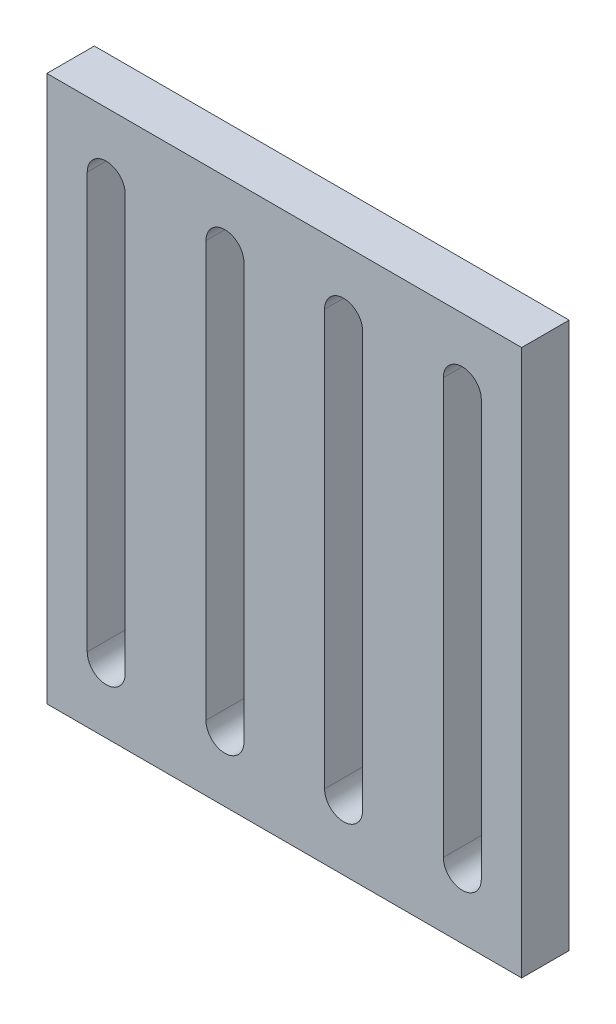
ISO-10303-21;
HEADER;
FILE_DESCRIPTION(('STEP AP214'),'2;1');
FILE_NAME('part.step','',(''),(''),'','','');
FILE_SCHEMA(('AUTOMOTIVE_DESIGN { 1 0 10303 214 1 1 1 1 }'));
ENDSEC;
DATA;
#1=APPLICATION_CONTEXT('core data for automotive mechanical design processes');
#2=APPLICATION_PROTOCOL_DEFINITION('international standard','automotive_design',2000,#1);
#3=PRODUCT_CONTEXT('',#1,'mechanical');
#4=PRODUCT('Part','Part','',(#3));
#5=PRODUCT_RELATED_PRODUCT_CATEGORY('part','',(#4));
#6=PRODUCT_DEFINITION_FORMATION('','',#4);
#7=PRODUCT_DEFINITION_CONTEXT('part definition',#1,'design');
#8=PRODUCT_DEFINITION('design','',#6,#7);
#9=PRODUCT_DEFINITION_SHAPE('','',#8);
#10=(LENGTH_UNIT() NAMED_UNIT(*) SI_UNIT(.MILLI.,.METRE.));
#11=(NAMED_UNIT(*) PLANE_ANGLE_UNIT() SI_UNIT($,.RADIAN.));
#12=(NAMED_UNIT(*) SI_UNIT($,.STERADIAN.) SOLID_ANGLE_UNIT());
#13=UNCERTAINTY_MEASURE_WITH_UNIT(LENGTH_MEASURE(1.E-05),#10,'distance_accuracy_value','');
#14=(GEOMETRIC_REPRESENTATION_CONTEXT(3) GLOBAL_UNCERTAINTY_ASSIGNED_CONTEXT((#13)) GLOBAL_UNIT_ASSIGNED_CONTEXT((#10,
#11,#12)) REPRESENTATION_CONTEXT('',''));
#15=CARTESIAN_POINT('',(0.,0.,0.));
#16=DIRECTION('',(0.,0.,1.));
#17=DIRECTION('',(1.,0.,0.));
#18=AXIS2_PLACEMENT_3D('',#15,#16,#17);
#19=CARTESIAN_POINT('',(0.,0.,4.));
#20=DIRECTION('',(0.,0.,-1.));
#21=DIRECTION('',(-1.,0.,0.));
#22=AXIS2_PLACEMENT_3D('',#19,#20,#21);
#23=PLANE('',#22);
#24=DIRECTION('',(0.,1.,0.));
#25=VECTOR('',#24,1.);
#26=CARTESIAN_POINT('',(5.,-23.,4.));
#27=LINE('',#26,#25);
#28=CARTESIAN_POINT('',(5.,-23.,4.));
#29=VERTEX_POINT('',#28);
#30=CARTESIAN_POINT('',(5.,23.,4.));
#31=VERTEX_POINT('',#30);
#32=EDGE_CURVE('E313',#29,#31,#27,.T.);
#33=ORIENTED_EDGE('',*,*,#32,.T.);
#34=DIRECTION('',(-1.,0.,0.));
#35=VECTOR('',#34,1.);
#36=CARTESIAN_POINT('',(-5.,23.,4.));
#37=LINE('',#36,#35);
#38=CARTESIAN_POINT('',(-35.,23.,4.));
#39=VERTEX_POINT('',#38);
#40=EDGE_CURVE('E316',#31,#39,#37,.T.);
#41=ORIENTED_EDGE('',*,*,#40,.T.);
#42=DIRECTION('',(0.,-1.,0.));
#43=VECTOR('',#42,1.);
#44=CARTESIAN_POINT('',(-35.,-23.,4.));
#45=LINE('',#44,#43);
#46=CARTESIAN_POINT('',(-35.,-23.,4.));
#47=VERTEX_POINT('',#46);
#48=EDGE_CURVE('E214',#39,#47,#45,.T.);
#49=ORIENTED_EDGE('',*,*,#48,.T.);
#50=DIRECTION('',(1.,0.,0.));
#51=VECTOR('',#50,1.);
#52=CARTESIAN_POINT('',(-5.,-23.,4.));
#53=LINE('',#52,#51);
#54=EDGE_CURVE('E319',#47,#29,#53,.T.);
#55=ORIENTED_EDGE('',*,*,#54,.T.);
#56=EDGE_LOOP('',(#33,#41,#49,#55));
#57=FACE_BOUND('',#56,.T.);
#58=CARTESIAN_POINT('',(0.,17.5,4.));
#59=DIRECTION('',(0.,0.,1.));
#60=DIRECTION('',(1.,0.,0.));
#61=AXIS2_PLACEMENT_3D('',#58,#59,#60);
#62=CIRCLE('',#61,1.6);
#63=CARTESIAN_POINT('',(1.59999999999999,17.5,4.));
#64=VERTEX_POINT('',#63);
#65=CARTESIAN_POINT('',(-1.60000000000001,17.5,4.));
#66=VERTEX_POINT('',#65);
#67=EDGE_CURVE('E287',#64,#66,#62,.T.);
#68=ORIENTED_EDGE('',*,*,#67,.F.);
#69=DIRECTION('',(0.,1.,0.));
#70=VECTOR('',#69,1.);
#71=CARTESIAN_POINT('',(1.59999999999999,17.5,4.));
#72=LINE('',#71,#70);
#73=CARTESIAN_POINT('',(1.6,-17.5,4.));
#74=VERTEX_POINT('',#73);
#75=EDGE_CURVE('E294',#74,#64,#72,.T.);
#76=ORIENTED_EDGE('',*,*,#75,.F.);
#77=CARTESIAN_POINT('',(0.,-17.5,4.));
#78=DIRECTION('',(0.,0.,1.));
#79=DIRECTION('',(1.,0.,0.));
#80=AXIS2_PLACEMENT_3D('',#77,#78,#79);
#81=CIRCLE('',#80,1.6);
#82=CARTESIAN_POINT('',(-1.6,-17.5,4.));
#83=VERTEX_POINT('',#82);
#84=EDGE_CURVE('E292',#83,#74,#81,.T.);
#85=ORIENTED_EDGE('',*,*,#84,.F.);
#86=DIRECTION('',(0.,-1.,0.));
#87=VECTOR('',#86,1.);
#88=CARTESIAN_POINT('',(-1.60000000000001,17.5,4.));
#89=LINE('',#88,#87);
#90=EDGE_CURVE('E289',#66,#83,#89,.T.);
#91=ORIENTED_EDGE('',*,*,#90,.F.);
#92=EDGE_LOOP('',(#68,#76,#85,#91));
#93=FACE_BOUND('',#92,.T.);
#94=CARTESIAN_POINT('',(-10.,17.5,4.));
#95=DIRECTION('',(0.,0.,1.));
#96=DIRECTION('',(1.,0.,0.));
#97=AXIS2_PLACEMENT_3D('',#94,#95,#96);
#98=CIRCLE('',#97,1.6);
#99=CARTESIAN_POINT('',(-8.40000000000001,17.5,4.));
#100=VERTEX_POINT('',#99);
#101=CARTESIAN_POINT('',(-11.6,17.5,4.));
#102=VERTEX_POINT('',#101);
#103=EDGE_CURVE('E257',#100,#102,#98,.T.);
#104=ORIENTED_EDGE('',*,*,#103,.F.);
#105=DIRECTION('',(0.,1.,0.));
#106=VECTOR('',#105,1.);
#107=CARTESIAN_POINT('',(-8.40000000000001,17.5,4.));
#108=LINE('',#107,#106);
#109=CARTESIAN_POINT('',(-8.4,-17.5,4.));
#110=VERTEX_POINT('',#109);
#111=EDGE_CURVE('E265',#110,#100,#108,.T.);
#112=ORIENTED_EDGE('',*,*,#111,.F.);
#113=CARTESIAN_POINT('',(-10.,-17.5,4.));
#114=DIRECTION('',(0.,0.,1.));
#115=DIRECTION('',(1.,0.,0.));
#116=AXIS2_PLACEMENT_3D('',#113,#114,#115);
#117=CIRCLE('',#116,1.6);
#118=CARTESIAN_POINT('',(-11.6,-17.5,4.));
#119=VERTEX_POINT('',#118);
#120=EDGE_CURVE('E262',#119,#110,#117,.T.);
#121=ORIENTED_EDGE('',*,*,#120,.F.);
#122=DIRECTION('',(0.,-1.,0.));
#123=VECTOR('',#122,1.);
#124=CARTESIAN_POINT('',(-11.6,17.5,4.));
#125=LINE('',#124,#123);
#126=EDGE_CURVE('E259',#102,#119,#125,.T.);
#127=ORIENTED_EDGE('',*,*,#126,.F.);
#128=EDGE_LOOP('',(#104,#112,#121,#127));
#129=FACE_BOUND('',#128,.T.);
#130=CARTESIAN_POINT('',(-20.,17.5,4.));
#131=DIRECTION('',(0.,0.,1.));
#132=DIRECTION('',(1.,0.,0.));
#133=AXIS2_PLACEMENT_3D('',#130,#131,#132);
#134=CIRCLE('',#133,1.6);
#135=CARTESIAN_POINT('',(-18.4,17.5,4.));
#136=VERTEX_POINT('',#135);
#137=CARTESIAN_POINT('',(-21.6,17.5,4.));
#138=VERTEX_POINT('',#137);
#139=EDGE_CURVE('E226',#136,#138,#134,.T.);
#140=ORIENTED_EDGE('',*,*,#139,.F.);
#141=DIRECTION('',(0.,1.,0.));
#142=VECTOR('',#141,1.);
#143=CARTESIAN_POINT('',(-18.4,17.5,4.));
#144=LINE('',#143,#142);
#145=CARTESIAN_POINT('',(-18.4,-17.5,4.));
#146=VERTEX_POINT('',#145);
#147=EDGE_CURVE('E234',#146,#136,#144,.T.);
#148=ORIENTED_EDGE('',*,*,#147,.F.);
#149=CARTESIAN_POINT('',(-20.,-17.5,4.));
#150=DIRECTION('',(0.,0.,1.));
#151=DIRECTION('',(1.,0.,0.));
#152=AXIS2_PLACEMENT_3D('',#149,#150,#151);
#153=CIRCLE('',#152,1.6);
#154=CARTESIAN_POINT('',(-21.6,-17.5,4.));
#155=VERTEX_POINT('',#154);
#156=EDGE_CURVE('E231',#155,#146,#153,.T.);
#157=ORIENTED_EDGE('',*,*,#156,.F.);
#158=DIRECTION('',(0.,-1.,0.));
#159=VECTOR('',#158,1.);
#160=CARTESIAN_POINT('',(-21.6,17.5,4.));
#161=LINE('',#160,#159);
#162=EDGE_CURVE('E228',#138,#155,#161,.T.);
#163=ORIENTED_EDGE('',*,*,#162,.F.);
#164=EDGE_LOOP('',(#140,#148,#157,#163));
#165=FACE_BOUND('',#164,.T.);
#166=CARTESIAN_POINT('',(-30.,17.5,4.));
#167=DIRECTION('',(0.,0.,1.));
#168=DIRECTION('',(1.,0.,0.));
#169=AXIS2_PLACEMENT_3D('',#166,#167,#168);
#170=CIRCLE('',#169,1.6);
#171=CARTESIAN_POINT('',(-28.4,17.5,4.));
#172=VERTEX_POINT('',#171);
#173=CARTESIAN_POINT('',(-31.6,17.5,4.));
#174=VERTEX_POINT('',#173);
#175=EDGE_CURVE('E173',#172,#174,#170,.T.);
#176=ORIENTED_EDGE('',*,*,#175,.F.);
#177=DIRECTION('',(0.,1.,0.));
#178=VECTOR('',#177,1.);
#179=CARTESIAN_POINT('',(-28.4,17.5,4.));
#180=LINE('',#179,#178);
#181=CARTESIAN_POINT('',(-28.4,-17.5,4.));
#182=VERTEX_POINT('',#181);
#183=EDGE_CURVE('E198',#182,#172,#180,.T.);
#184=ORIENTED_EDGE('',*,*,#183,.F.);
#185=CARTESIAN_POINT('',(-30.,-17.5,4.));
#186=DIRECTION('',(0.,0.,1.));
#187=DIRECTION('',(1.,0.,0.));
#188=AXIS2_PLACEMENT_3D('',#185,#186,#187);
#189=CIRCLE('',#188,1.6);
#190=CARTESIAN_POINT('',(-31.6,-17.5,4.));
#191=VERTEX_POINT('',#190);
#192=EDGE_CURVE('E196',#191,#182,#189,.T.);
#193=ORIENTED_EDGE('',*,*,#192,.F.);
#194=DIRECTION('',(0.,-1.,0.));
#195=VECTOR('',#194,1.);
#196=CARTESIAN_POINT('',(-31.6,17.5,4.));
#197=LINE('',#196,#195);
#198=EDGE_CURVE('E183',#174,#191,#197,.T.);
#199=ORIENTED_EDGE('',*,*,#198,.F.);
#200=EDGE_LOOP('',(#176,#184,#193,#199));
#201=FACE_BOUND('',#200,.T.);
#202=ADVANCED_FACE('F33',(#57,#93,#129,#165,#201),#23,.F.);
#203=CARTESIAN_POINT('',(0.,0.,0.));
#204=DIRECTION('',(0.,0.,-1.));
#205=DIRECTION('',(-1.,0.,0.));
#206=AXIS2_PLACEMENT_3D('',#203,#204,#205);
#207=PLANE('',#206);
#208=DIRECTION('',(0.,1.,0.));
#209=VECTOR('',#208,1.);
#210=CARTESIAN_POINT('',(5.,-23.,0.));
#211=LINE('',#210,#209);
#212=CARTESIAN_POINT('',(5.,-23.,0.));
#213=VERTEX_POINT('',#212);
#214=CARTESIAN_POINT('',(5.,23.,0.));
#215=VERTEX_POINT('',#214);
#216=EDGE_CURVE('E312',#213,#215,#211,.T.);
#217=ORIENTED_EDGE('',*,*,#216,.F.);
#218=DIRECTION('',(1.,0.,0.));
#219=VECTOR('',#218,1.);
#220=CARTESIAN_POINT('',(-5.,-23.,0.));
#221=LINE('',#220,#219);
#222=CARTESIAN_POINT('',(-35.,-23.,0.));
#223=VERTEX_POINT('',#222);
#224=EDGE_CURVE('E317',#223,#213,#221,.T.);
#225=ORIENTED_EDGE('',*,*,#224,.F.);
#226=DIRECTION('',(0.,-1.,0.));
#227=VECTOR('',#226,1.);
#228=CARTESIAN_POINT('',(-35.,-23.,0.));
#229=LINE('',#228,#227);
#230=CARTESIAN_POINT('',(-35.,23.,0.));
#231=VERTEX_POINT('',#230);
#232=EDGE_CURVE('E191',#231,#223,#229,.T.);
#233=ORIENTED_EDGE('',*,*,#232,.F.);
#234=DIRECTION('',(-1.,0.,0.));
#235=VECTOR('',#234,1.);
#236=CARTESIAN_POINT('',(-5.,23.,0.));
#237=LINE('',#236,#235);
#238=EDGE_CURVE('E323',#215,#231,#237,.T.);
#239=ORIENTED_EDGE('',*,*,#238,.F.);
#240=EDGE_LOOP('',(#217,#225,#233,#239));
#241=FACE_BOUND('',#240,.T.);
#242=DIRECTION('',(0.,1.,0.));
#243=VECTOR('',#242,1.);
#244=CARTESIAN_POINT('',(1.59999999999999,17.5,0.));
#245=LINE('',#244,#243);
#246=CARTESIAN_POINT('',(1.6,-17.5,0.));
#247=VERTEX_POINT('',#246);
#248=CARTESIAN_POINT('',(1.59999999999999,17.5,0.));
#249=VERTEX_POINT('',#248);
#250=EDGE_CURVE('E290',#247,#249,#245,.T.);
#251=ORIENTED_EDGE('',*,*,#250,.T.);
#252=CARTESIAN_POINT('',(0.,17.5,0.));
#253=DIRECTION('',(0.,0.,1.));
#254=DIRECTION('',(1.,0.,0.));
#255=AXIS2_PLACEMENT_3D('',#252,#253,#254);
#256=CIRCLE('',#255,1.6);
#257=CARTESIAN_POINT('',(-1.60000000000001,17.5,0.));
#258=VERTEX_POINT('',#257);
#259=EDGE_CURVE('E56',#249,#258,#256,.T.);
#260=ORIENTED_EDGE('',*,*,#259,.T.);
#261=DIRECTION('',(0.,-1.,0.));
#262=VECTOR('',#261,1.);
#263=CARTESIAN_POINT('',(-1.60000000000001,17.5,0.));
#264=LINE('',#263,#262);
#265=CARTESIAN_POINT('',(-1.6,-17.5,0.));
#266=VERTEX_POINT('',#265);
#267=EDGE_CURVE('E298',#258,#266,#264,.T.);
#268=ORIENTED_EDGE('',*,*,#267,.T.);
#269=CARTESIAN_POINT('',(0.,-17.5,0.));
#270=DIRECTION('',(0.,0.,1.));
#271=DIRECTION('',(1.,0.,0.));
#272=AXIS2_PLACEMENT_3D('',#269,#270,#271);
#273=CIRCLE('',#272,1.6);
#274=EDGE_CURVE('E301',#266,#247,#273,.T.);
#275=ORIENTED_EDGE('',*,*,#274,.T.);
#276=EDGE_LOOP('',(#251,#260,#268,#275));
#277=FACE_BOUND('',#276,.T.);
#278=DIRECTION('',(0.,1.,0.));
#279=VECTOR('',#278,1.);
#280=CARTESIAN_POINT('',(-8.40000000000001,17.5,0.));
#281=LINE('',#280,#279);
#282=CARTESIAN_POINT('',(-8.4,-17.5,0.));
#283=VERTEX_POINT('',#282);
#284=CARTESIAN_POINT('',(-8.40000000000001,17.5,0.));
#285=VERTEX_POINT('',#284);
#286=EDGE_CURVE('E260',#283,#285,#281,.T.);
#287=ORIENTED_EDGE('',*,*,#286,.T.);
#288=CARTESIAN_POINT('',(-10.,17.5,0.));
#289=DIRECTION('',(0.,0.,1.));
#290=DIRECTION('',(1.,0.,0.));
#291=AXIS2_PLACEMENT_3D('',#288,#289,#290);
#292=CIRCLE('',#291,1.6);
#293=CARTESIAN_POINT('',(-11.6,17.5,0.));
#294=VERTEX_POINT('',#293);
#295=EDGE_CURVE('E256',#285,#294,#292,.T.);
#296=ORIENTED_EDGE('',*,*,#295,.T.);
#297=DIRECTION('',(0.,-1.,0.));
#298=VECTOR('',#297,1.);
#299=CARTESIAN_POINT('',(-11.6,17.5,0.));
#300=LINE('',#299,#298);
#301=CARTESIAN_POINT('',(-11.6,-17.5,0.));
#302=VERTEX_POINT('',#301);
#303=EDGE_CURVE('E270',#294,#302,#300,.T.);
#304=ORIENTED_EDGE('',*,*,#303,.T.);
#305=CARTESIAN_POINT('',(-10.,-17.5,0.));
#306=DIRECTION('',(0.,0.,1.));
#307=DIRECTION('',(1.,0.,0.));
#308=AXIS2_PLACEMENT_3D('',#305,#306,#307);
#309=CIRCLE('',#308,1.6);
#310=EDGE_CURVE('E273',#302,#283,#309,.T.);
#311=ORIENTED_EDGE('',*,*,#310,.T.);
#312=EDGE_LOOP('',(#287,#296,#304,#311));
#313=FACE_BOUND('',#312,.T.);
#314=DIRECTION('',(0.,1.,0.));
#315=VECTOR('',#314,1.);
#316=CARTESIAN_POINT('',(-18.4,17.5,0.));
#317=LINE('',#316,#315);
#318=CARTESIAN_POINT('',(-18.4,-17.5,0.));
#319=VERTEX_POINT('',#318);
#320=CARTESIAN_POINT('',(-18.4,17.5,0.));
#321=VERTEX_POINT('',#320);
#322=EDGE_CURVE('E229',#319,#321,#317,.T.);
#323=ORIENTED_EDGE('',*,*,#322,.T.);
#324=CARTESIAN_POINT('',(-20.,17.5,0.));
#325=DIRECTION('',(0.,0.,1.));
#326=DIRECTION('',(1.,0.,0.));
#327=AXIS2_PLACEMENT_3D('',#324,#325,#326);
#328=CIRCLE('',#327,1.6);
#329=CARTESIAN_POINT('',(-21.6,17.5,0.));
#330=VERTEX_POINT('',#329);
#331=EDGE_CURVE('E225',#321,#330,#328,.T.);
#332=ORIENTED_EDGE('',*,*,#331,.T.);
#333=DIRECTION('',(0.,-1.,0.));
#334=VECTOR('',#333,1.);
#335=CARTESIAN_POINT('',(-21.6,17.5,0.));
#336=LINE('',#335,#334);
#337=CARTESIAN_POINT('',(-21.6,-17.5,0.));
#338=VERTEX_POINT('',#337);
#339=EDGE_CURVE('E239',#330,#338,#336,.T.);
#340=ORIENTED_EDGE('',*,*,#339,.T.);
#341=CARTESIAN_POINT('',(-20.,-17.5,0.));
#342=DIRECTION('',(0.,0.,1.));
#343=DIRECTION('',(1.,0.,0.));
#344=AXIS2_PLACEMENT_3D('',#341,#342,#343);
#345=CIRCLE('',#344,1.6);
#346=EDGE_CURVE('E242',#338,#319,#345,.T.);
#347=ORIENTED_EDGE('',*,*,#346,.T.);
#348=EDGE_LOOP('',(#323,#332,#340,#347));
#349=FACE_BOUND('',#348,.T.);
#350=DIRECTION('',(0.,1.,0.));
#351=VECTOR('',#350,1.);
#352=CARTESIAN_POINT('',(-28.4,17.5,0.));
#353=LINE('',#352,#351);
#354=CARTESIAN_POINT('',(-28.4,-17.5,0.));
#355=VERTEX_POINT('',#354);
#356=CARTESIAN_POINT('',(-28.4,17.5,0.));
#357=VERTEX_POINT('',#356);
#358=EDGE_CURVE('E184',#355,#357,#353,.T.);
#359=ORIENTED_EDGE('',*,*,#358,.T.);
#360=CARTESIAN_POINT('',(-30.,17.5,0.));
#361=DIRECTION('',(0.,0.,1.));
#362=DIRECTION('',(1.,0.,0.));
#363=AXIS2_PLACEMENT_3D('',#360,#361,#362);
#364=CIRCLE('',#363,1.6);
#365=CARTESIAN_POINT('',(-31.6,17.5,0.));
#366=VERTEX_POINT('',#365);
#367=EDGE_CURVE('E202',#357,#366,#364,.T.);
#368=ORIENTED_EDGE('',*,*,#367,.T.);
#369=DIRECTION('',(0.,-1.,0.));
#370=VECTOR('',#369,1.);
#371=CARTESIAN_POINT('',(-31.6,17.5,0.));
#372=LINE('',#371,#370);
#373=CARTESIAN_POINT('',(-31.6,-17.5,0.));
#374=VERTEX_POINT('',#373);
#375=EDGE_CURVE('E190',#366,#374,#372,.T.);
#376=ORIENTED_EDGE('',*,*,#375,.T.);
#377=CARTESIAN_POINT('',(-30.,-17.5,0.));
#378=DIRECTION('',(0.,0.,1.));
#379=DIRECTION('',(1.,0.,0.));
#380=AXIS2_PLACEMENT_3D('',#377,#378,#379);
#381=CIRCLE('',#380,1.6);
#382=EDGE_CURVE('E205',#374,#355,#381,.T.);
#383=ORIENTED_EDGE('',*,*,#382,.T.);
#384=EDGE_LOOP('',(#359,#368,#376,#383));
#385=FACE_BOUND('',#384,.T.);
#386=ADVANCED_FACE('F333',(#241,#277,#313,#349,#385),#207,.T.);
#387=CARTESIAN_POINT('',(5.,-23.,4.));
#388=DIRECTION('',(-1.,0.,0.));
#389=DIRECTION('',(0.,0.,1.));
#390=AXIS2_PLACEMENT_3D('',#387,#388,#389);
#391=PLANE('',#390);
#392=ORIENTED_EDGE('',*,*,#216,.T.);
#393=DIRECTION('',(0.,0.,-1.));
#394=VECTOR('',#393,1.);
#395=CARTESIAN_POINT('',(5.,23.,4.));
#396=LINE('',#395,#394);
#397=EDGE_CURVE('E11',#31,#215,#396,.T.);
#398=ORIENTED_EDGE('',*,*,#397,.F.);
#399=ORIENTED_EDGE('',*,*,#32,.F.);
#400=DIRECTION('',(0.,0.,-1.));
#401=VECTOR('',#400,1.);
#402=CARTESIAN_POINT('',(5.,-23.,4.));
#403=LINE('',#402,#401);
#404=EDGE_CURVE('E41',#29,#213,#403,.T.);
#405=ORIENTED_EDGE('',*,*,#404,.T.);
#406=EDGE_LOOP('',(#392,#398,#399,#405));
#407=FACE_BOUND('',#406,.T.);
#408=ADVANCED_FACE('F35',(#407),#391,.F.);
#409=CARTESIAN_POINT('',(-5.,23.,4.));
#410=DIRECTION('',(0.,-1.,0.));
#411=DIRECTION('',(0.,0.,-1.));
#412=AXIS2_PLACEMENT_3D('',#409,#410,#411);
#413=PLANE('',#412);
#414=ORIENTED_EDGE('',*,*,#238,.T.);
#415=DIRECTION('',(0.,0.,-1.));
#416=VECTOR('',#415,1.);
#417=CARTESIAN_POINT('',(-35.,23.,4.));
#418=LINE('',#417,#416);
#419=EDGE_CURVE('E222',#39,#231,#418,.T.);
#420=ORIENTED_EDGE('',*,*,#419,.F.);
#421=ORIENTED_EDGE('',*,*,#40,.F.);
#422=ORIENTED_EDGE('',*,*,#397,.T.);
#423=EDGE_LOOP('',(#414,#420,#421,#422));
#424=FACE_BOUND('',#423,.T.);
#425=ADVANCED_FACE('F338',(#424),#413,.F.);
#426=CARTESIAN_POINT('',(-5.,-23.,4.));
#427=DIRECTION('',(0.,1.,0.));
#428=DIRECTION('',(0.,0.,1.));
#429=AXIS2_PLACEMENT_3D('',#426,#427,#428);
#430=PLANE('',#429);
#431=ORIENTED_EDGE('',*,*,#224,.T.);
#432=ORIENTED_EDGE('',*,*,#404,.F.);
#433=ORIENTED_EDGE('',*,*,#54,.F.);
#434=DIRECTION('',(0.,0.,-1.));
#435=VECTOR('',#434,1.);
#436=CARTESIAN_POINT('',(-35.,-23.,4.));
#437=LINE('',#436,#435);
#438=EDGE_CURVE('E217',#47,#223,#437,.T.);
#439=ORIENTED_EDGE('',*,*,#438,.T.);
#440=EDGE_LOOP('',(#431,#432,#433,#439));
#441=FACE_BOUND('',#440,.T.);
#442=ADVANCED_FACE('F343',(#441),#430,.F.);
#443=CARTESIAN_POINT('',(0.,17.5,4.));
#444=DIRECTION('',(0.,0.,-1.));
#445=DIRECTION('',(-1.,0.,0.));
#446=AXIS2_PLACEMENT_3D('',#443,#444,#445);
#447=CYLINDRICAL_SURFACE('',#446,1.6);
#448=ORIENTED_EDGE('',*,*,#259,.F.);
#449=DIRECTION('',(0.,0.,-1.));
#450=VECTOR('',#449,1.);
#451=CARTESIAN_POINT('',(1.59999999999999,17.5,4.));
#452=LINE('',#451,#450);
#453=EDGE_CURVE('E296',#64,#249,#452,.T.);
#454=ORIENTED_EDGE('',*,*,#453,.F.);
#455=ORIENTED_EDGE('',*,*,#67,.T.);
#456=DIRECTION('',(0.,0.,-1.));
#457=VECTOR('',#456,1.);
#458=CARTESIAN_POINT('',(-1.60000000000001,17.5,4.));
#459=LINE('',#458,#457);
#460=EDGE_CURVE('E310',#66,#258,#459,.T.);
#461=ORIENTED_EDGE('',*,*,#460,.T.);
#462=EDGE_LOOP('',(#448,#454,#455,#461));
#463=FACE_BOUND('',#462,.T.);
#464=ADVANCED_FACE('F364',(#463),#447,.F.);
#465=CARTESIAN_POINT('',(-1.60000000000001,17.5,4.));
#466=DIRECTION('',(1.,0.,0.));
#467=DIRECTION('',(0.,1.,0.));
#468=AXIS2_PLACEMENT_3D('',#465,#466,#467);
#469=PLANE('',#468);
#470=ORIENTED_EDGE('',*,*,#267,.F.);
#471=ORIENTED_EDGE('',*,*,#460,.F.);
#472=ORIENTED_EDGE('',*,*,#90,.T.);
#473=DIRECTION('',(0.,0.,-1.));
#474=VECTOR('',#473,1.);
#475=CARTESIAN_POINT('',(-1.6,-17.5,4.));
#476=LINE('',#475,#474);
#477=EDGE_CURVE('E308',#83,#266,#476,.T.);
#478=ORIENTED_EDGE('',*,*,#477,.T.);
#479=EDGE_LOOP('',(#470,#471,#472,#478));
#480=FACE_BOUND('',#479,.T.);
#481=ADVANCED_FACE('F523',(#480),#469,.T.);
#482=CARTESIAN_POINT('',(0.,-17.5,4.));
#483=DIRECTION('',(0.,0.,-1.));
#484=DIRECTION('',(-1.,0.,0.));
#485=AXIS2_PLACEMENT_3D('',#482,#483,#484);
#486=CYLINDRICAL_SURFACE('',#485,1.6);
#487=ORIENTED_EDGE('',*,*,#274,.F.);
#488=ORIENTED_EDGE('',*,*,#477,.F.);
#489=ORIENTED_EDGE('',*,*,#84,.T.);
#490=DIRECTION('',(0.,0.,-1.));
#491=VECTOR('',#490,1.);
#492=CARTESIAN_POINT('',(1.6,-17.5,4.));
#493=LINE('',#492,#491);
#494=EDGE_CURVE('E48',#74,#247,#493,.T.);
#495=ORIENTED_EDGE('',*,*,#494,.T.);
#496=EDGE_LOOP('',(#487,#488,#489,#495));
#497=FACE_BOUND('',#496,.T.);
#498=ADVANCED_FACE('F521',(#497),#486,.F.);
#499=CARTESIAN_POINT('',(1.59999999999999,17.5,4.));
#500=DIRECTION('',(-1.,0.,0.));
#501=DIRECTION('',(0.,-1.,0.));
#502=AXIS2_PLACEMENT_3D('',#499,#500,#501);
#503=PLANE('',#502);
#504=ORIENTED_EDGE('',*,*,#250,.F.);
#505=ORIENTED_EDGE('',*,*,#494,.F.);
#506=ORIENTED_EDGE('',*,*,#75,.T.);
#507=ORIENTED_EDGE('',*,*,#453,.T.);
#508=EDGE_LOOP('',(#504,#505,#506,#507));
#509=FACE_BOUND('',#508,.T.);
#510=ADVANCED_FACE('F407',(#509),#503,.T.);
#511=CARTESIAN_POINT('',(-10.,17.5,4.));
#512=DIRECTION('',(0.,0.,-1.));
#513=DIRECTION('',(-1.,0.,0.));
#514=AXIS2_PLACEMENT_3D('',#511,#512,#513);
#515=CYLINDRICAL_SURFACE('',#514,1.6);
#516=ORIENTED_EDGE('',*,*,#295,.F.);
#517=DIRECTION('',(0.,0.,-1.));
#518=VECTOR('',#517,1.);
#519=CARTESIAN_POINT('',(-8.40000000000001,17.5,4.));
#520=LINE('',#519,#518);
#521=EDGE_CURVE('E267',#100,#285,#520,.T.);
#522=ORIENTED_EDGE('',*,*,#521,.F.);
#523=ORIENTED_EDGE('',*,*,#103,.T.);
#524=DIRECTION('',(0.,0.,-1.));
#525=VECTOR('',#524,1.);
#526=CARTESIAN_POINT('',(-11.6,17.5,4.));
#527=LINE('',#526,#525);
#528=EDGE_CURVE('E284',#102,#294,#527,.T.);
#529=ORIENTED_EDGE('',*,*,#528,.T.);
#530=EDGE_LOOP('',(#516,#522,#523,#529));
#531=FACE_BOUND('',#530,.T.);
#532=ADVANCED_FACE('F402',(#531),#515,.F.);
#533=CARTESIAN_POINT('',(-11.6,17.5,4.));
#534=DIRECTION('',(1.,0.,0.));
#535=DIRECTION('',(0.,1.,0.));
#536=AXIS2_PLACEMENT_3D('',#533,#534,#535);
#537=PLANE('',#536);
#538=ORIENTED_EDGE('',*,*,#303,.F.);
#539=ORIENTED_EDGE('',*,*,#528,.F.);
#540=ORIENTED_EDGE('',*,*,#126,.T.);
#541=DIRECTION('',(0.,0.,-1.));
#542=VECTOR('',#541,1.);
#543=CARTESIAN_POINT('',(-11.6,-17.5,4.));
#544=LINE('',#543,#542);
#545=EDGE_CURVE('E282',#119,#302,#544,.T.);
#546=ORIENTED_EDGE('',*,*,#545,.T.);
#547=EDGE_LOOP('',(#538,#539,#540,#546));
#548=FACE_BOUND('',#547,.T.);
#549=ADVANCED_FACE('F406',(#548),#537,.T.);
#550=CARTESIAN_POINT('',(-10.,-17.5,4.));
#551=DIRECTION('',(0.,0.,-1.));
#552=DIRECTION('',(-1.,0.,0.));
#553=AXIS2_PLACEMENT_3D('',#550,#551,#552);
#554=CYLINDRICAL_SURFACE('',#553,1.6);
#555=ORIENTED_EDGE('',*,*,#310,.F.);
#556=ORIENTED_EDGE('',*,*,#545,.F.);
#557=ORIENTED_EDGE('',*,*,#120,.T.);
#558=DIRECTION('',(0.,0.,-1.));
#559=VECTOR('',#558,1.);
#560=CARTESIAN_POINT('',(-8.4,-17.5,4.));
#561=LINE('',#560,#559);
#562=EDGE_CURVE('E280',#110,#283,#561,.T.);
#563=ORIENTED_EDGE('',*,*,#562,.T.);
#564=EDGE_LOOP('',(#555,#556,#557,#563));
#565=FACE_BOUND('',#564,.T.);
#566=ADVANCED_FACE('F418',(#565),#554,.F.);
#567=CARTESIAN_POINT('',(-8.40000000000001,17.5,4.));
#568=DIRECTION('',(-1.,0.,0.));
#569=DIRECTION('',(0.,-1.,0.));
#570=AXIS2_PLACEMENT_3D('',#567,#568,#569);
#571=PLANE('',#570);
#572=ORIENTED_EDGE('',*,*,#286,.F.);
#573=ORIENTED_EDGE('',*,*,#562,.F.);
#574=ORIENTED_EDGE('',*,*,#111,.T.);
#575=ORIENTED_EDGE('',*,*,#521,.T.);
#576=EDGE_LOOP('',(#572,#573,#574,#575));
#577=FACE_BOUND('',#576,.T.);
#578=ADVANCED_FACE('F428',(#577),#571,.T.);
#579=CARTESIAN_POINT('',(-20.,17.5,4.));
#580=DIRECTION('',(0.,0.,-1.));
#581=DIRECTION('',(-1.,0.,0.));
#582=AXIS2_PLACEMENT_3D('',#579,#580,#581);
#583=CYLINDRICAL_SURFACE('',#582,1.6);
#584=ORIENTED_EDGE('',*,*,#331,.F.);
#585=DIRECTION('',(0.,0.,-1.));
#586=VECTOR('',#585,1.);
#587=CARTESIAN_POINT('',(-18.4,17.5,4.));
#588=LINE('',#587,#586);
#589=EDGE_CURVE('E236',#136,#321,#588,.T.);
#590=ORIENTED_EDGE('',*,*,#589,.F.);
#591=ORIENTED_EDGE('',*,*,#139,.T.);
#592=DIRECTION('',(0.,0.,-1.));
#593=VECTOR('',#592,1.);
#594=CARTESIAN_POINT('',(-21.6,17.5,4.));
#595=LINE('',#594,#593);
#596=EDGE_CURVE('E253',#138,#330,#595,.T.);
#597=ORIENTED_EDGE('',*,*,#596,.T.);
#598=EDGE_LOOP('',(#584,#590,#591,#597));
#599=FACE_BOUND('',#598,.T.);
#600=ADVANCED_FACE('F438',(#599),#583,.F.);
#601=CARTESIAN_POINT('',(-21.6,17.5,4.));
#602=DIRECTION('',(1.,0.,0.));
#603=DIRECTION('',(0.,1.,0.));
#604=AXIS2_PLACEMENT_3D('',#601,#602,#603);
#605=PLANE('',#604);
#606=ORIENTED_EDGE('',*,*,#339,.F.);
#607=ORIENTED_EDGE('',*,*,#596,.F.);
#608=ORIENTED_EDGE('',*,*,#162,.T.);
#609=DIRECTION('',(0.,0.,-1.));
#610=VECTOR('',#609,1.);
#611=CARTESIAN_POINT('',(-21.6,-17.5,4.));
#612=LINE('',#611,#610);
#613=EDGE_CURVE('E251',#155,#338,#612,.T.);
#614=ORIENTED_EDGE('',*,*,#613,.T.);
#615=EDGE_LOOP('',(#606,#607,#608,#614));
#616=FACE_BOUND('',#615,.T.);
#617=ADVANCED_FACE('F448',(#616),#605,.T.);
#618=CARTESIAN_POINT('',(-20.,-17.5,4.));
#619=DIRECTION('',(0.,0.,-1.));
#620=DIRECTION('',(-1.,0.,0.));
#621=AXIS2_PLACEMENT_3D('',#618,#619,#620);
#622=CYLINDRICAL_SURFACE('',#621,1.6);
#623=ORIENTED_EDGE('',*,*,#346,.F.);
#624=ORIENTED_EDGE('',*,*,#613,.F.);
#625=ORIENTED_EDGE('',*,*,#156,.T.);
#626=DIRECTION('',(0.,0.,-1.));
#627=VECTOR('',#626,1.);
#628=CARTESIAN_POINT('',(-18.4,-17.5,4.));
#629=LINE('',#628,#627);
#630=EDGE_CURVE('E249',#146,#319,#629,.T.);
#631=ORIENTED_EDGE('',*,*,#630,.T.);
#632=EDGE_LOOP('',(#623,#624,#625,#631));
#633=FACE_BOUND('',#632,.T.);
#634=ADVANCED_FACE('F354',(#633),#622,.F.);
#635=CARTESIAN_POINT('',(-18.4,17.5,4.));
#636=DIRECTION('',(-1.,0.,0.));
#637=DIRECTION('',(0.,-1.,0.));
#638=AXIS2_PLACEMENT_3D('',#635,#636,#637);
#639=PLANE('',#638);
#640=ORIENTED_EDGE('',*,*,#322,.F.);
#641=ORIENTED_EDGE('',*,*,#630,.F.);
#642=ORIENTED_EDGE('',*,*,#147,.T.);
#643=ORIENTED_EDGE('',*,*,#589,.T.);
#644=EDGE_LOOP('',(#640,#641,#642,#643));
#645=FACE_BOUND('',#644,.T.);
#646=ADVANCED_FACE('F347',(#645),#639,.T.);
#647=CARTESIAN_POINT('',(-35.,-23.,4.));
#648=DIRECTION('',(1.,0.,0.));
#649=DIRECTION('',(0.,0.,-1.));
#650=AXIS2_PLACEMENT_3D('',#647,#648,#649);
#651=PLANE('',#650);
#652=ORIENTED_EDGE('',*,*,#232,.T.);
#653=ORIENTED_EDGE('',*,*,#438,.F.);
#654=ORIENTED_EDGE('',*,*,#48,.F.);
#655=ORIENTED_EDGE('',*,*,#419,.T.);
#656=EDGE_LOOP('',(#652,#653,#654,#655));
#657=FACE_BOUND('',#656,.T.);
#658=ADVANCED_FACE('F345',(#657),#651,.F.);
#659=CARTESIAN_POINT('',(-30.,17.5,4.));
#660=DIRECTION('',(0.,0.,-1.));
#661=DIRECTION('',(-1.,0.,0.));
#662=AXIS2_PLACEMENT_3D('',#659,#660,#661);
#663=CYLINDRICAL_SURFACE('',#662,1.6);
#664=ORIENTED_EDGE('',*,*,#367,.F.);
#665=DIRECTION('',(0.,0.,-1.));
#666=VECTOR('',#665,1.);
#667=CARTESIAN_POINT('',(-28.4,17.5,4.));
#668=LINE('',#667,#666);
#669=EDGE_CURVE('E179',#172,#357,#668,.T.);
#670=ORIENTED_EDGE('',*,*,#669,.F.);
#671=ORIENTED_EDGE('',*,*,#175,.T.);
#672=DIRECTION('',(0.,0.,-1.));
#673=VECTOR('',#672,1.);
#674=CARTESIAN_POINT('',(-31.6,17.5,4.));
#675=LINE('',#674,#673);
#676=EDGE_CURVE('E176',#174,#366,#675,.T.);
#677=ORIENTED_EDGE('',*,*,#676,.T.);
#678=EDGE_LOOP('',(#664,#670,#671,#677));
#679=FACE_BOUND('',#678,.T.);
#680=ADVANCED_FACE('F175',(#679),#663,.F.);
#681=CARTESIAN_POINT('',(-31.6,17.5,4.));
#682=DIRECTION('',(1.,0.,0.));
#683=DIRECTION('',(0.,1.,0.));
#684=AXIS2_PLACEMENT_3D('',#681,#682,#683);
#685=PLANE('',#684);
#686=ORIENTED_EDGE('',*,*,#375,.F.);
#687=ORIENTED_EDGE('',*,*,#676,.F.);
#688=ORIENTED_EDGE('',*,*,#198,.T.);
#689=DIRECTION('',(0.,0.,-1.));
#690=VECTOR('',#689,1.);
#691=CARTESIAN_POINT('',(-31.6,-17.5,4.));
#692=LINE('',#691,#690);
#693=EDGE_CURVE('E192',#191,#374,#692,.T.);
#694=ORIENTED_EDGE('',*,*,#693,.T.);
#695=EDGE_LOOP('',(#686,#687,#688,#694));
#696=FACE_BOUND('',#695,.T.);
#697=ADVANCED_FACE('F187',(#696),#685,.T.);
#698=CARTESIAN_POINT('',(-30.,-17.5,4.));
#699=DIRECTION('',(0.,0.,-1.));
#700=DIRECTION('',(-1.,0.,0.));
#701=AXIS2_PLACEMENT_3D('',#698,#699,#700);
#702=CYLINDRICAL_SURFACE('',#701,1.6);
#703=ORIENTED_EDGE('',*,*,#382,.F.);
#704=ORIENTED_EDGE('',*,*,#693,.F.);
#705=ORIENTED_EDGE('',*,*,#192,.T.);
#706=DIRECTION('',(0.,0.,-1.));
#707=VECTOR('',#706,1.);
#708=CARTESIAN_POINT('',(-28.4,-17.5,4.));
#709=LINE('',#708,#707);
#710=EDGE_CURVE('E211',#182,#355,#709,.T.);
#711=ORIENTED_EDGE('',*,*,#710,.T.);
#712=EDGE_LOOP('',(#703,#704,#705,#711));
#713=FACE_BOUND('',#712,.T.);
#714=ADVANCED_FACE('F492',(#713),#702,.F.);
#715=CARTESIAN_POINT('',(-28.4,17.5,4.));
#716=DIRECTION('',(-1.,0.,0.));
#717=DIRECTION('',(0.,-1.,0.));
#718=AXIS2_PLACEMENT_3D('',#715,#716,#717);
#719=PLANE('',#718);
#720=ORIENTED_EDGE('',*,*,#358,.F.);
#721=ORIENTED_EDGE('',*,*,#710,.F.);
#722=ORIENTED_EDGE('',*,*,#183,.T.);
#723=ORIENTED_EDGE('',*,*,#669,.T.);
#724=EDGE_LOOP('',(#720,#721,#722,#723));
#725=FACE_BOUND('',#724,.T.);
#726=ADVANCED_FACE('F501',(#725),#719,.T.);
#727=CLOSED_SHELL('',(#202,#386,#408,#425,#442,#464,#481,#498,#510,#532,#549,#566,#578,#600,
#617,#634,#646,#658,#680,#697,#714,#726));
#728=MANIFOLD_SOLID_BREP('B2',#727);
#729=ADVANCED_BREP_SHAPE_REPRESENTATION('',(#18,#728),#14);
#730=SHAPE_DEFINITION_REPRESENTATION(#9,#729);
ENDSEC;
END-ISO-10303-21;
